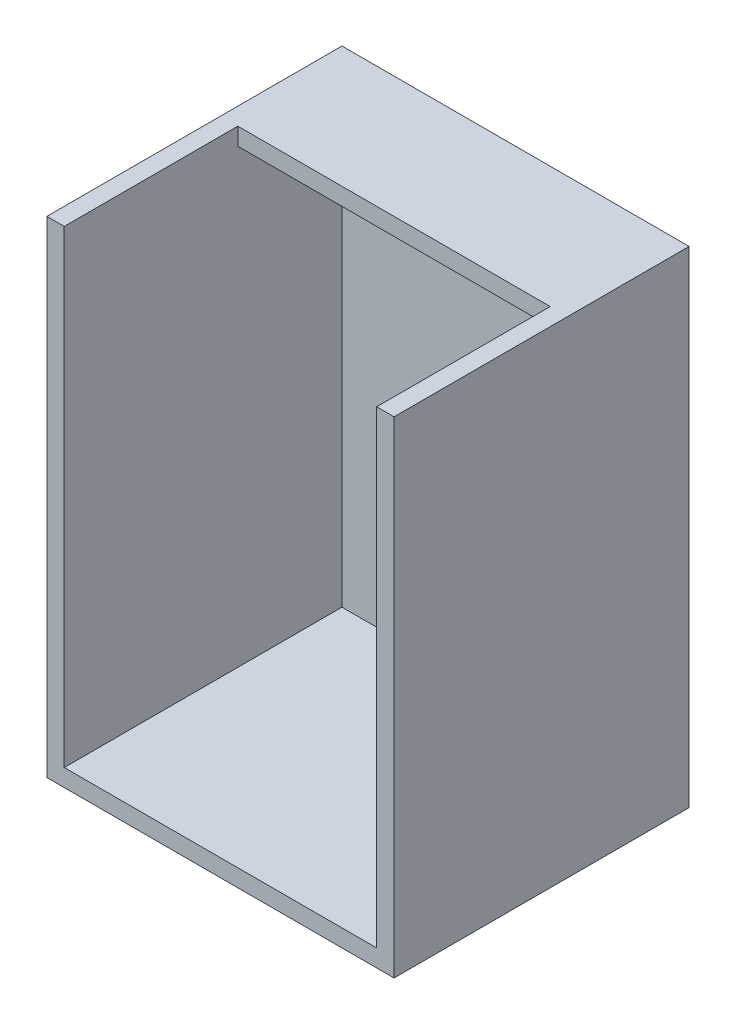
ISO-10303-21;
HEADER;
FILE_DESCRIPTION(('STEP AP214'),'2;1');
FILE_NAME('part.step','',(''),(''),'','','');
FILE_SCHEMA(('AUTOMOTIVE_DESIGN { 1 0 10303 214 1 1 1 1 }'));
ENDSEC;
DATA;
#1=APPLICATION_CONTEXT('core data for automotive mechanical design processes');
#2=APPLICATION_PROTOCOL_DEFINITION('international standard','automotive_design',2000,#1);
#3=PRODUCT_CONTEXT('',#1,'mechanical');
#4=PRODUCT('Part','Part','',(#3));
#5=PRODUCT_RELATED_PRODUCT_CATEGORY('part','',(#4));
#6=PRODUCT_DEFINITION_FORMATION('','',#4);
#7=PRODUCT_DEFINITION_CONTEXT('part definition',#1,'design');
#8=PRODUCT_DEFINITION('design','',#6,#7);
#9=PRODUCT_DEFINITION_SHAPE('','',#8);
#10=(LENGTH_UNIT() NAMED_UNIT(*) SI_UNIT(.MILLI.,.METRE.));
#11=(NAMED_UNIT(*) PLANE_ANGLE_UNIT() SI_UNIT($,.RADIAN.));
#12=(NAMED_UNIT(*) SI_UNIT($,.STERADIAN.) SOLID_ANGLE_UNIT());
#13=UNCERTAINTY_MEASURE_WITH_UNIT(LENGTH_MEASURE(1.E-05),#10,'distance_accuracy_value','');
#14=(GEOMETRIC_REPRESENTATION_CONTEXT(3) GLOBAL_UNCERTAINTY_ASSIGNED_CONTEXT((#13)) GLOBAL_UNIT_ASSIGNED_CONTEXT((#10,
#11,#12)) REPRESENTATION_CONTEXT('',''));
#15=CARTESIAN_POINT('',(0.,0.,0.));
#16=DIRECTION('',(0.,0.,1.));
#17=DIRECTION('',(1.,0.,0.));
#18=AXIS2_PLACEMENT_3D('',#15,#16,#17);
#19=CARTESIAN_POINT('',(0.,0.,35.));
#20=DIRECTION('',(0.,0.,1.));
#21=DIRECTION('',(1.,0.,0.));
#22=AXIS2_PLACEMENT_3D('',#19,#20,#21);
#23=PLANE('',#22);
#24=DIRECTION('',(-1.,0.,0.));
#25=VECTOR('',#24,1.);
#26=CARTESIAN_POINT('',(-50.,70.,35.));
#27=LINE('',#26,#25);
#28=CARTESIAN_POINT('',(45.,70.,35.));
#29=VERTEX_POINT('',#28);
#30=CARTESIAN_POINT('',(-45.,70.,35.));
#31=VERTEX_POINT('',#30);
#32=EDGE_CURVE('E185',#29,#31,#27,.T.);
#33=ORIENTED_EDGE('',*,*,#32,.T.);
#34=DIRECTION('',(0.,-1.,0.));
#35=VECTOR('',#34,1.);
#36=CARTESIAN_POINT('',(-45.,0.,35.));
#37=LINE('',#36,#35);
#38=CARTESIAN_POINT('',(-45.,65.,35.));
#39=VERTEX_POINT('',#38);
#40=EDGE_CURVE('E142',#31,#39,#37,.T.);
#41=ORIENTED_EDGE('',*,*,#40,.T.);
#42=DIRECTION('',(-1.,0.,0.));
#43=VECTOR('',#42,1.);
#44=CARTESIAN_POINT('',(-45.,65.,35.));
#45=LINE('',#44,#43);
#46=CARTESIAN_POINT('',(45.,65.,35.));
#47=VERTEX_POINT('',#46);
#48=EDGE_CURVE('E163',#47,#39,#45,.T.);
#49=ORIENTED_EDGE('',*,*,#48,.F.);
#50=DIRECTION('',(0.,1.,0.));
#51=VECTOR('',#50,1.);
#52=CARTESIAN_POINT('',(45.,0.,35.));
#53=LINE('',#52,#51);
#54=EDGE_CURVE('E11',#47,#29,#53,.T.);
#55=ORIENTED_EDGE('',*,*,#54,.T.);
#56=EDGE_LOOP('',(#33,#41,#49,#55));
#57=FACE_BOUND('',#56,.T.);
#58=ADVANCED_FACE('F39',(#57),#23,.T.);
#59=CARTESIAN_POINT('',(-50.,70.,5.));
#60=DIRECTION('',(0.,-1.,0.));
#61=DIRECTION('',(1.,0.,0.));
#62=AXIS2_PLACEMENT_3D('',#59,#60,#61);
#63=PLANE('',#62);
#64=DIRECTION('',(-1.,0.,0.));
#65=VECTOR('',#64,1.);
#66=CARTESIAN_POINT('',(-50.,70.,0.));
#67=LINE('',#66,#65);
#68=CARTESIAN_POINT('',(50.,70.,0.));
#69=VERTEX_POINT('',#68);
#70=CARTESIAN_POINT('',(-50.,70.,0.));
#71=VERTEX_POINT('',#70);
#72=EDGE_CURVE('E188',#69,#71,#67,.T.);
#73=ORIENTED_EDGE('',*,*,#72,.T.);
#74=DIRECTION('',(0.,0.,-1.));
#75=VECTOR('',#74,1.);
#76=CARTESIAN_POINT('',(-50.,70.,5.));
#77=LINE('',#76,#75);
#78=CARTESIAN_POINT('',(-50.,70.,85.));
#79=VERTEX_POINT('',#78);
#80=EDGE_CURVE('E43',#79,#71,#77,.T.);
#81=ORIENTED_EDGE('',*,*,#80,.F.);
#82=DIRECTION('',(1.,0.,0.));
#83=VECTOR('',#82,1.);
#84=CARTESIAN_POINT('',(0.,70.,85.));
#85=LINE('',#84,#83);
#86=CARTESIAN_POINT('',(-45.,70.,85.));
#87=VERTEX_POINT('',#86);
#88=EDGE_CURVE('E147',#79,#87,#85,.T.);
#89=ORIENTED_EDGE('',*,*,#88,.T.);
#90=DIRECTION('',(0.,0.,-1.));
#91=VECTOR('',#90,1.);
#92=CARTESIAN_POINT('',(-45.,70.,85.));
#93=LINE('',#92,#91);
#94=EDGE_CURVE('E159',#87,#31,#93,.T.);
#95=ORIENTED_EDGE('',*,*,#94,.T.);
#96=ORIENTED_EDGE('',*,*,#32,.F.);
#97=DIRECTION('',(0.,0.,-1.));
#98=VECTOR('',#97,1.);
#99=CARTESIAN_POINT('',(45.,70.,85.));
#100=LINE('',#99,#98);
#101=CARTESIAN_POINT('',(45.,70.,85.));
#102=VERTEX_POINT('',#101);
#103=EDGE_CURVE('E55',#102,#29,#100,.T.);
#104=ORIENTED_EDGE('',*,*,#103,.F.);
#105=DIRECTION('',(1.,0.,0.));
#106=VECTOR('',#105,1.);
#107=CARTESIAN_POINT('',(0.,70.,85.));
#108=LINE('',#107,#106);
#109=CARTESIAN_POINT('',(50.,70.,85.));
#110=VERTEX_POINT('',#109);
#111=EDGE_CURVE('E158',#102,#110,#108,.T.);
#112=ORIENTED_EDGE('',*,*,#111,.T.);
#113=DIRECTION('',(0.,0.,-1.));
#114=VECTOR('',#113,1.);
#115=CARTESIAN_POINT('',(50.,70.,5.));
#116=LINE('',#115,#114);
#117=EDGE_CURVE('E127',#110,#69,#116,.T.);
#118=ORIENTED_EDGE('',*,*,#117,.T.);
#119=EDGE_LOOP('',(#73,#81,#89,#95,#96,#104,#112,#118));
#120=FACE_BOUND('',#119,.T.);
#121=ADVANCED_FACE('F41',(#120),#63,.F.);
#122=CARTESIAN_POINT('',(-50.,-70.,5.));
#123=DIRECTION('',(1.,0.,0.));
#124=DIRECTION('',(0.,0.,-1.));
#125=AXIS2_PLACEMENT_3D('',#122,#123,#124);
#126=PLANE('',#125);
#127=DIRECTION('',(0.,-1.,0.));
#128=VECTOR('',#127,1.);
#129=CARTESIAN_POINT('',(-50.,-70.,0.));
#130=LINE('',#129,#128);
#131=CARTESIAN_POINT('',(-50.,-70.,0.));
#132=VERTEX_POINT('',#131);
#133=EDGE_CURVE('E191',#71,#132,#130,.T.);
#134=ORIENTED_EDGE('',*,*,#133,.T.);
#135=DIRECTION('',(0.,0.,-1.));
#136=VECTOR('',#135,1.);
#137=CARTESIAN_POINT('',(-50.,-70.,5.));
#138=LINE('',#137,#136);
#139=CARTESIAN_POINT('',(-50.,-70.,85.));
#140=VERTEX_POINT('',#139);
#141=EDGE_CURVE('E126',#140,#132,#138,.T.);
#142=ORIENTED_EDGE('',*,*,#141,.F.);
#143=DIRECTION('',(0.,1.,0.));
#144=VECTOR('',#143,1.);
#145=CARTESIAN_POINT('',(-50.,0.,85.));
#146=LINE('',#145,#144);
#147=EDGE_CURVE('E138',#140,#79,#146,.T.);
#148=ORIENTED_EDGE('',*,*,#147,.T.);
#149=ORIENTED_EDGE('',*,*,#80,.T.);
#150=EDGE_LOOP('',(#134,#142,#148,#149));
#151=FACE_BOUND('',#150,.T.);
#152=ADVANCED_FACE('F198',(#151),#126,.F.);
#153=CARTESIAN_POINT('',(-50.,-70.,5.));
#154=DIRECTION('',(0.,1.,0.));
#155=DIRECTION('',(-1.,0.,0.));
#156=AXIS2_PLACEMENT_3D('',#153,#154,#155);
#157=PLANE('',#156);
#158=DIRECTION('',(1.,0.,0.));
#159=VECTOR('',#158,1.);
#160=CARTESIAN_POINT('',(-50.,-70.,0.));
#161=LINE('',#160,#159);
#162=CARTESIAN_POINT('',(50.,-70.,0.));
#163=VERTEX_POINT('',#162);
#164=EDGE_CURVE('E122',#132,#163,#161,.T.);
#165=ORIENTED_EDGE('',*,*,#164,.T.);
#166=DIRECTION('',(0.,0.,-1.));
#167=VECTOR('',#166,1.);
#168=CARTESIAN_POINT('',(50.,-70.,5.));
#169=LINE('',#168,#167);
#170=CARTESIAN_POINT('',(50.,-70.,85.));
#171=VERTEX_POINT('',#170);
#172=EDGE_CURVE('E116',#171,#163,#169,.T.);
#173=ORIENTED_EDGE('',*,*,#172,.F.);
#174=DIRECTION('',(-1.,0.,0.));
#175=VECTOR('',#174,1.);
#176=CARTESIAN_POINT('',(0.,-70.,85.));
#177=LINE('',#176,#175);
#178=EDGE_CURVE('E120',#171,#140,#177,.T.);
#179=ORIENTED_EDGE('',*,*,#178,.T.);
#180=ORIENTED_EDGE('',*,*,#141,.T.);
#181=EDGE_LOOP('',(#165,#173,#179,#180));
#182=FACE_BOUND('',#181,.T.);
#183=ADVANCED_FACE('F118',(#182),#157,.F.);
#184=CARTESIAN_POINT('',(50.,-70.,5.));
#185=DIRECTION('',(-1.,0.,0.));
#186=DIRECTION('',(0.,0.,1.));
#187=AXIS2_PLACEMENT_3D('',#184,#185,#186);
#188=PLANE('',#187);
#189=DIRECTION('',(0.,1.,0.));
#190=VECTOR('',#189,1.);
#191=CARTESIAN_POINT('',(50.,-70.,0.));
#192=LINE('',#191,#190);
#193=EDGE_CURVE('E194',#163,#69,#192,.T.);
#194=ORIENTED_EDGE('',*,*,#193,.T.);
#195=ORIENTED_EDGE('',*,*,#117,.F.);
#196=DIRECTION('',(0.,-1.,0.));
#197=VECTOR('',#196,1.);
#198=CARTESIAN_POINT('',(50.,0.,85.));
#199=LINE('',#198,#197);
#200=EDGE_CURVE('E134',#110,#171,#199,.T.);
#201=ORIENTED_EDGE('',*,*,#200,.T.);
#202=ORIENTED_EDGE('',*,*,#172,.T.);
#203=EDGE_LOOP('',(#194,#195,#201,#202));
#204=FACE_BOUND('',#203,.T.);
#205=ADVANCED_FACE('F140',(#204),#188,.F.);
#206=CARTESIAN_POINT('',(0.,0.,0.));
#207=DIRECTION('',(0.,0.,1.));
#208=DIRECTION('',(1.,0.,0.));
#209=AXIS2_PLACEMENT_3D('',#206,#207,#208);
#210=PLANE('',#209);
#211=ORIENTED_EDGE('',*,*,#72,.F.);
#212=ORIENTED_EDGE('',*,*,#193,.F.);
#213=ORIENTED_EDGE('',*,*,#164,.F.);
#214=ORIENTED_EDGE('',*,*,#133,.F.);
#215=EDGE_LOOP('',(#211,#212,#213,#214));
#216=FACE_BOUND('',#215,.T.);
#217=ADVANCED_FACE('F202',(#216),#210,.F.);
#218=CARTESIAN_POINT('',(-45.,65.,35.));
#219=DIRECTION('',(1.,0.,0.));
#220=DIRECTION('',(0.,0.,-1.));
#221=AXIS2_PLACEMENT_3D('',#218,#219,#220);
#222=PLANE('',#221);
#223=DIRECTION('',(0.,-1.,0.));
#224=VECTOR('',#223,1.);
#225=CARTESIAN_POINT('',(-45.,65.,5.));
#226=LINE('',#225,#224);
#227=CARTESIAN_POINT('',(-45.,65.,5.));
#228=VERTEX_POINT('',#227);
#229=CARTESIAN_POINT('',(-45.,-65.,5.));
#230=VERTEX_POINT('',#229);
#231=EDGE_CURVE('E62',#228,#230,#226,.T.);
#232=ORIENTED_EDGE('',*,*,#231,.F.);
#233=DIRECTION('',(0.,0.,-1.));
#234=VECTOR('',#233,1.);
#235=CARTESIAN_POINT('',(-45.,65.,35.));
#236=LINE('',#235,#234);
#237=EDGE_CURVE('E166',#39,#228,#236,.T.);
#238=ORIENTED_EDGE('',*,*,#237,.F.);
#239=ORIENTED_EDGE('',*,*,#40,.F.);
#240=ORIENTED_EDGE('',*,*,#94,.F.);
#241=DIRECTION('',(0.,-1.,0.));
#242=VECTOR('',#241,1.);
#243=CARTESIAN_POINT('',(-45.,0.,85.));
#244=LINE('',#243,#242);
#245=CARTESIAN_POINT('',(-45.,-65.,85.));
#246=VERTEX_POINT('',#245);
#247=EDGE_CURVE('E150',#87,#246,#244,.T.);
#248=ORIENTED_EDGE('',*,*,#247,.T.);
#249=DIRECTION('',(0.,0.,-1.));
#250=VECTOR('',#249,1.);
#251=CARTESIAN_POINT('',(-45.,-65.,35.));
#252=LINE('',#251,#250);
#253=EDGE_CURVE('E182',#246,#230,#252,.T.);
#254=ORIENTED_EDGE('',*,*,#253,.T.);
#255=EDGE_LOOP('',(#232,#238,#239,#240,#248,#254));
#256=FACE_BOUND('',#255,.T.);
#257=ADVANCED_FACE('F204',(#256),#222,.T.);
#258=CARTESIAN_POINT('',(-45.,-65.,35.));
#259=DIRECTION('',(0.,1.,0.));
#260=DIRECTION('',(0.,0.,1.));
#261=AXIS2_PLACEMENT_3D('',#258,#259,#260);
#262=PLANE('',#261);
#263=DIRECTION('',(1.,0.,0.));
#264=VECTOR('',#263,1.);
#265=CARTESIAN_POINT('',(-45.,-65.,5.));
#266=LINE('',#265,#264);
#267=CARTESIAN_POINT('',(45.,-65.,5.));
#268=VERTEX_POINT('',#267);
#269=EDGE_CURVE('E169',#230,#268,#266,.T.);
#270=ORIENTED_EDGE('',*,*,#269,.F.);
#271=ORIENTED_EDGE('',*,*,#253,.F.);
#272=DIRECTION('',(1.,0.,0.));
#273=VECTOR('',#272,1.);
#274=CARTESIAN_POINT('',(0.,-65.,85.));
#275=LINE('',#274,#273);
#276=CARTESIAN_POINT('',(45.,-65.,85.));
#277=VERTEX_POINT('',#276);
#278=EDGE_CURVE('E153',#246,#277,#275,.T.);
#279=ORIENTED_EDGE('',*,*,#278,.T.);
#280=DIRECTION('',(0.,0.,-1.));
#281=VECTOR('',#280,1.);
#282=CARTESIAN_POINT('',(45.,-65.,35.));
#283=LINE('',#282,#281);
#284=EDGE_CURVE('E179',#277,#268,#283,.T.);
#285=ORIENTED_EDGE('',*,*,#284,.T.);
#286=EDGE_LOOP('',(#270,#271,#279,#285));
#287=FACE_BOUND('',#286,.T.);
#288=ADVANCED_FACE('F210',(#287),#262,.T.);
#289=CARTESIAN_POINT('',(45.,65.,35.));
#290=DIRECTION('',(-1.,0.,0.));
#291=DIRECTION('',(0.,-1.,0.));
#292=AXIS2_PLACEMENT_3D('',#289,#290,#291);
#293=PLANE('',#292);
#294=DIRECTION('',(0.,1.,0.));
#295=VECTOR('',#294,1.);
#296=CARTESIAN_POINT('',(45.,65.,5.));
#297=LINE('',#296,#295);
#298=CARTESIAN_POINT('',(45.,65.,5.));
#299=VERTEX_POINT('',#298);
#300=EDGE_CURVE('E171',#268,#299,#297,.T.);
#301=ORIENTED_EDGE('',*,*,#300,.F.);
#302=ORIENTED_EDGE('',*,*,#284,.F.);
#303=DIRECTION('',(0.,1.,0.));
#304=VECTOR('',#303,1.);
#305=CARTESIAN_POINT('',(45.,0.,85.));
#306=LINE('',#305,#304);
#307=EDGE_CURVE('E156',#277,#102,#306,.T.);
#308=ORIENTED_EDGE('',*,*,#307,.T.);
#309=ORIENTED_EDGE('',*,*,#103,.T.);
#310=ORIENTED_EDGE('',*,*,#54,.F.);
#311=DIRECTION('',(0.,0.,-1.));
#312=VECTOR('',#311,1.);
#313=CARTESIAN_POINT('',(45.,65.,35.));
#314=LINE('',#313,#312);
#315=EDGE_CURVE('E176',#47,#299,#314,.T.);
#316=ORIENTED_EDGE('',*,*,#315,.T.);
#317=EDGE_LOOP('',(#301,#302,#308,#309,#310,#316));
#318=FACE_BOUND('',#317,.T.);
#319=ADVANCED_FACE('F230',(#318),#293,.T.);
#320=CARTESIAN_POINT('',(-45.,65.,35.));
#321=DIRECTION('',(0.,-1.,0.));
#322=DIRECTION('',(0.,0.,-1.));
#323=AXIS2_PLACEMENT_3D('',#320,#321,#322);
#324=PLANE('',#323);
#325=DIRECTION('',(-1.,0.,0.));
#326=VECTOR('',#325,1.);
#327=CARTESIAN_POINT('',(-45.,65.,5.));
#328=LINE('',#327,#326);
#329=EDGE_CURVE('E167',#299,#228,#328,.T.);
#330=ORIENTED_EDGE('',*,*,#329,.F.);
#331=ORIENTED_EDGE('',*,*,#315,.F.);
#332=ORIENTED_EDGE('',*,*,#48,.T.);
#333=ORIENTED_EDGE('',*,*,#237,.T.);
#334=EDGE_LOOP('',(#330,#331,#332,#333));
#335=FACE_BOUND('',#334,.T.);
#336=ADVANCED_FACE('F224',(#335),#324,.T.);
#337=CARTESIAN_POINT('',(0.,0.,5.));
#338=DIRECTION('',(0.,0.,1.));
#339=DIRECTION('',(1.,0.,0.));
#340=AXIS2_PLACEMENT_3D('',#337,#338,#339);
#341=PLANE('',#340);
#342=ORIENTED_EDGE('',*,*,#231,.T.);
#343=ORIENTED_EDGE('',*,*,#269,.T.);
#344=ORIENTED_EDGE('',*,*,#300,.T.);
#345=ORIENTED_EDGE('',*,*,#329,.T.);
#346=EDGE_LOOP('',(#342,#343,#344,#345));
#347=FACE_BOUND('',#346,.T.);
#348=ADVANCED_FACE('F223',(#347),#341,.T.);
#349=CARTESIAN_POINT('',(0.,0.,85.));
#350=DIRECTION('',(0.,0.,-1.));
#351=DIRECTION('',(-1.,0.,0.));
#352=AXIS2_PLACEMENT_3D('',#349,#350,#351);
#353=PLANE('',#352);
#354=ORIENTED_EDGE('',*,*,#200,.F.);
#355=ORIENTED_EDGE('',*,*,#111,.F.);
#356=ORIENTED_EDGE('',*,*,#307,.F.);
#357=ORIENTED_EDGE('',*,*,#278,.F.);
#358=ORIENTED_EDGE('',*,*,#247,.F.);
#359=ORIENTED_EDGE('',*,*,#88,.F.);
#360=ORIENTED_EDGE('',*,*,#147,.F.);
#361=ORIENTED_EDGE('',*,*,#178,.F.);
#362=EDGE_LOOP('',(#354,#355,#356,#357,#358,#359,#360,#361));
#363=FACE_BOUND('',#362,.T.);
#364=ADVANCED_FACE('F132',(#363),#353,.F.);
#365=CLOSED_SHELL('',(#58,#121,#152,#183,#205,#217,#257,#288,#319,#336,#348,#364));
#366=MANIFOLD_SOLID_BREP('B2',#365);
#367=ADVANCED_BREP_SHAPE_REPRESENTATION('',(#18,#366),#14);
#368=SHAPE_DEFINITION_REPRESENTATION(#9,#367);
ENDSEC;
END-ISO-10303-21;
